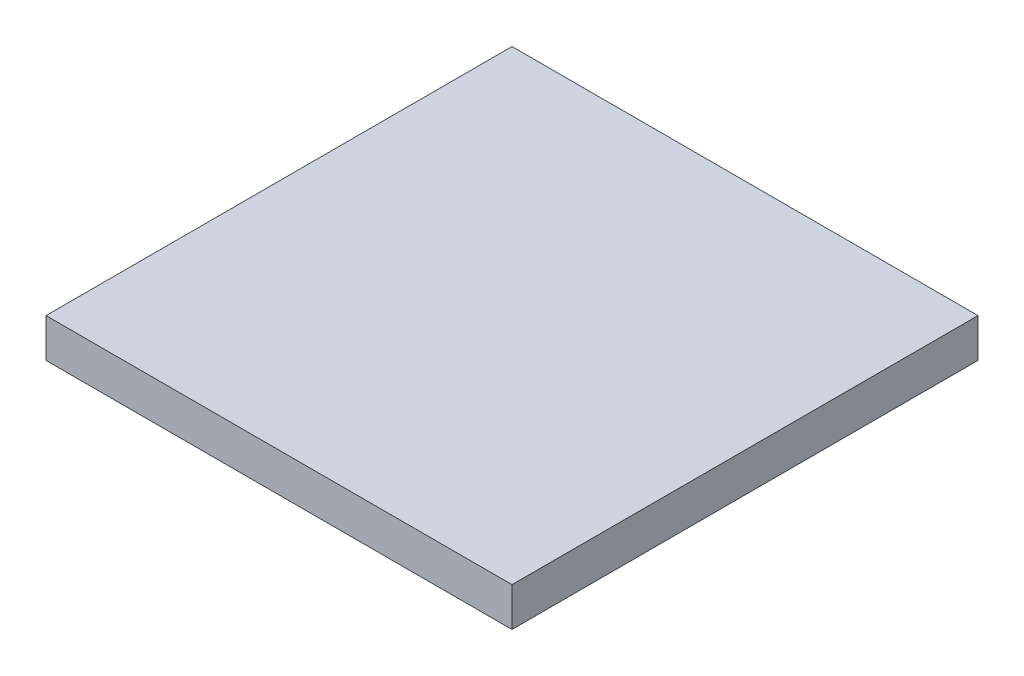
ISO-10303-21;
HEADER;
FILE_DESCRIPTION(('STEP AP214'),'2;1');
FILE_NAME('part.step','',(''),(''),'','','');
FILE_SCHEMA(('AUTOMOTIVE_DESIGN { 1 0 10303 214 1 1 1 1 }'));
ENDSEC;
DATA;
#1=APPLICATION_CONTEXT('core data for automotive mechanical design processes');
#2=APPLICATION_PROTOCOL_DEFINITION('international standard','automotive_design',2000,#1);
#3=PRODUCT_CONTEXT('',#1,'mechanical');
#4=PRODUCT('Part','Part','',(#3));
#5=PRODUCT_RELATED_PRODUCT_CATEGORY('part','',(#4));
#6=PRODUCT_DEFINITION_FORMATION('','',#4);
#7=PRODUCT_DEFINITION_CONTEXT('part definition',#1,'design');
#8=PRODUCT_DEFINITION('design','',#6,#7);
#9=PRODUCT_DEFINITION_SHAPE('','',#8);
#10=(LENGTH_UNIT() NAMED_UNIT(*) SI_UNIT(.MILLI.,.METRE.));
#11=(NAMED_UNIT(*) PLANE_ANGLE_UNIT() SI_UNIT($,.RADIAN.));
#12=(NAMED_UNIT(*) SI_UNIT($,.STERADIAN.) SOLID_ANGLE_UNIT());
#13=UNCERTAINTY_MEASURE_WITH_UNIT(LENGTH_MEASURE(1.E-05),#10,'distance_accuracy_value','');
#14=(GEOMETRIC_REPRESENTATION_CONTEXT(3) GLOBAL_UNCERTAINTY_ASSIGNED_CONTEXT((#13)) GLOBAL_UNIT_ASSIGNED_CONTEXT((#10,
#11,#12)) REPRESENTATION_CONTEXT('',''));
#15=CARTESIAN_POINT('',(0.,0.,0.));
#16=DIRECTION('',(0.,0.,1.));
#17=DIRECTION('',(1.,0.,0.));
#18=AXIS2_PLACEMENT_3D('',#15,#16,#17);
#19=CARTESIAN_POINT('',(-19.05,3.175,-19.05));
#20=DIRECTION('',(1.,0.,0.));
#21=DIRECTION('',(0.,0.,-1.));
#22=AXIS2_PLACEMENT_3D('',#19,#20,#21);
#23=PLANE('',#22);
#24=DIRECTION('',(0.,0.,1.));
#25=VECTOR('',#24,1.);
#26=CARTESIAN_POINT('',(-19.05,0.,-19.05));
#27=LINE('',#26,#25);
#28=CARTESIAN_POINT('',(-19.05,0.,-19.05));
#29=VERTEX_POINT('',#28);
#30=CARTESIAN_POINT('',(-19.05,0.,19.05));
#31=VERTEX_POINT('',#30);
#32=EDGE_CURVE('E111',#29,#31,#27,.T.);
#33=ORIENTED_EDGE('',*,*,#32,.T.);
#34=DIRECTION('',(0.,-1.,0.));
#35=VECTOR('',#34,1.);
#36=CARTESIAN_POINT('',(-19.05,3.175,19.05));
#37=LINE('',#36,#35);
#38=CARTESIAN_POINT('',(-19.05,3.175,19.05));
#39=VERTEX_POINT('',#38);
#40=EDGE_CURVE('E11',#39,#31,#37,.T.);
#41=ORIENTED_EDGE('',*,*,#40,.F.);
#42=DIRECTION('',(0.,0.,1.));
#43=VECTOR('',#42,1.);
#44=CARTESIAN_POINT('',(-19.05,3.175,-19.05));
#45=LINE('',#44,#43);
#46=CARTESIAN_POINT('',(-19.05,3.175,-19.05));
#47=VERTEX_POINT('',#46);
#48=EDGE_CURVE('E95',#47,#39,#45,.T.);
#49=ORIENTED_EDGE('',*,*,#48,.F.);
#50=DIRECTION('',(0.,-1.,0.));
#51=VECTOR('',#50,1.);
#52=CARTESIAN_POINT('',(-19.05,3.175,-19.05));
#53=LINE('',#52,#51);
#54=EDGE_CURVE('E107',#47,#29,#53,.T.);
#55=ORIENTED_EDGE('',*,*,#54,.T.);
#56=EDGE_LOOP('',(#33,#41,#49,#55));
#57=FACE_BOUND('',#56,.T.);
#58=ADVANCED_FACE('F43',(#57),#23,.F.);
#59=CARTESIAN_POINT('',(-19.05,3.175,19.05));
#60=DIRECTION('',(0.,0.,-1.));
#61=DIRECTION('',(-1.,0.,0.));
#62=AXIS2_PLACEMENT_3D('',#59,#60,#61);
#63=PLANE('',#62);
#64=DIRECTION('',(1.,0.,0.));
#65=VECTOR('',#64,1.);
#66=CARTESIAN_POINT('',(-19.05,0.,19.05));
#67=LINE('',#66,#65);
#68=CARTESIAN_POINT('',(19.05,0.,19.05));
#69=VERTEX_POINT('',#68);
#70=EDGE_CURVE('E100',#31,#69,#67,.T.);
#71=ORIENTED_EDGE('',*,*,#70,.T.);
#72=DIRECTION('',(0.,-1.,0.));
#73=VECTOR('',#72,1.);
#74=CARTESIAN_POINT('',(19.05,3.175,19.05));
#75=LINE('',#74,#73);
#76=CARTESIAN_POINT('',(19.05,3.175,19.05));
#77=VERTEX_POINT('',#76);
#78=EDGE_CURVE('E52',#77,#69,#75,.T.);
#79=ORIENTED_EDGE('',*,*,#78,.F.);
#80=DIRECTION('',(1.,0.,0.));
#81=VECTOR('',#80,1.);
#82=CARTESIAN_POINT('',(-19.05,3.175,19.05));
#83=LINE('',#82,#81);
#84=EDGE_CURVE('E90',#39,#77,#83,.T.);
#85=ORIENTED_EDGE('',*,*,#84,.F.);
#86=ORIENTED_EDGE('',*,*,#40,.T.);
#87=EDGE_LOOP('',(#71,#79,#85,#86));
#88=FACE_BOUND('',#87,.T.);
#89=ADVANCED_FACE('F99',(#88),#63,.F.);
#90=CARTESIAN_POINT('',(19.05,3.175,-19.05));
#91=DIRECTION('',(-1.,0.,0.));
#92=DIRECTION('',(0.,0.,1.));
#93=AXIS2_PLACEMENT_3D('',#90,#91,#92);
#94=PLANE('',#93);
#95=DIRECTION('',(0.,0.,-1.));
#96=VECTOR('',#95,1.);
#97=CARTESIAN_POINT('',(19.05,0.,-19.05));
#98=LINE('',#97,#96);
#99=CARTESIAN_POINT('',(19.05,0.,-19.05));
#100=VERTEX_POINT('',#99);
#101=EDGE_CURVE('E77',#69,#100,#98,.T.);
#102=ORIENTED_EDGE('',*,*,#101,.T.);
#103=DIRECTION('',(0.,-1.,0.));
#104=VECTOR('',#103,1.);
#105=CARTESIAN_POINT('',(19.05,3.175,-19.05));
#106=LINE('',#105,#104);
#107=CARTESIAN_POINT('',(19.05,3.175,-19.05));
#108=VERTEX_POINT('',#107);
#109=EDGE_CURVE('E102',#108,#100,#106,.T.);
#110=ORIENTED_EDGE('',*,*,#109,.F.);
#111=DIRECTION('',(0.,0.,-1.));
#112=VECTOR('',#111,1.);
#113=CARTESIAN_POINT('',(19.05,3.175,-19.05));
#114=LINE('',#113,#112);
#115=EDGE_CURVE('E93',#77,#108,#114,.T.);
#116=ORIENTED_EDGE('',*,*,#115,.F.);
#117=ORIENTED_EDGE('',*,*,#78,.T.);
#118=EDGE_LOOP('',(#102,#110,#116,#117));
#119=FACE_BOUND('',#118,.T.);
#120=ADVANCED_FACE('F103',(#119),#94,.F.);
#121=CARTESIAN_POINT('',(-19.05,3.175,-19.05));
#122=DIRECTION('',(0.,0.,1.));
#123=DIRECTION('',(1.,0.,0.));
#124=AXIS2_PLACEMENT_3D('',#121,#122,#123);
#125=PLANE('',#124);
#126=DIRECTION('',(-1.,0.,0.));
#127=VECTOR('',#126,1.);
#128=CARTESIAN_POINT('',(-19.05,0.,-19.05));
#129=LINE('',#128,#127);
#130=EDGE_CURVE('E83',#100,#29,#129,.T.);
#131=ORIENTED_EDGE('',*,*,#130,.T.);
#132=ORIENTED_EDGE('',*,*,#54,.F.);
#133=DIRECTION('',(-1.,0.,0.));
#134=VECTOR('',#133,1.);
#135=CARTESIAN_POINT('',(-19.05,3.175,-19.05));
#136=LINE('',#135,#134);
#137=EDGE_CURVE('E60',#108,#47,#136,.T.);
#138=ORIENTED_EDGE('',*,*,#137,.F.);
#139=ORIENTED_EDGE('',*,*,#109,.T.);
#140=EDGE_LOOP('',(#131,#132,#138,#139));
#141=FACE_BOUND('',#140,.T.);
#142=ADVANCED_FACE('F124',(#141),#125,.F.);
#143=CARTESIAN_POINT('',(0.,3.175,0.));
#144=DIRECTION('',(0.,1.,0.));
#145=DIRECTION('',(0.,0.,1.));
#146=AXIS2_PLACEMENT_3D('',#143,#144,#145);
#147=PLANE('',#146);
#148=ORIENTED_EDGE('',*,*,#48,.T.);
#149=ORIENTED_EDGE('',*,*,#84,.T.);
#150=ORIENTED_EDGE('',*,*,#115,.T.);
#151=ORIENTED_EDGE('',*,*,#137,.T.);
#152=EDGE_LOOP('',(#148,#149,#150,#151));
#153=FACE_BOUND('',#152,.T.);
#154=ADVANCED_FACE('F91',(#153),#147,.T.);
#155=CARTESIAN_POINT('',(0.,0.,0.));
#156=DIRECTION('',(0.,1.,0.));
#157=DIRECTION('',(0.,0.,1.));
#158=AXIS2_PLACEMENT_3D('',#155,#156,#157);
#159=PLANE('',#158);
#160=ORIENTED_EDGE('',*,*,#32,.F.);
#161=ORIENTED_EDGE('',*,*,#130,.F.);
#162=ORIENTED_EDGE('',*,*,#101,.F.);
#163=ORIENTED_EDGE('',*,*,#70,.F.);
#164=EDGE_LOOP('',(#160,#161,#162,#163));
#165=FACE_BOUND('',#164,.T.);
#166=ADVANCED_FACE('F127',(#165),#159,.F.);
#167=CLOSED_SHELL('',(#58,#89,#120,#142,#154,#166));
#168=MANIFOLD_SOLID_BREP('B2',#167);
#169=ADVANCED_BREP_SHAPE_REPRESENTATION('',(#18,#168),#14);
#170=SHAPE_DEFINITION_REPRESENTATION(#9,#169);
ENDSEC;
END-ISO-10303-21;
